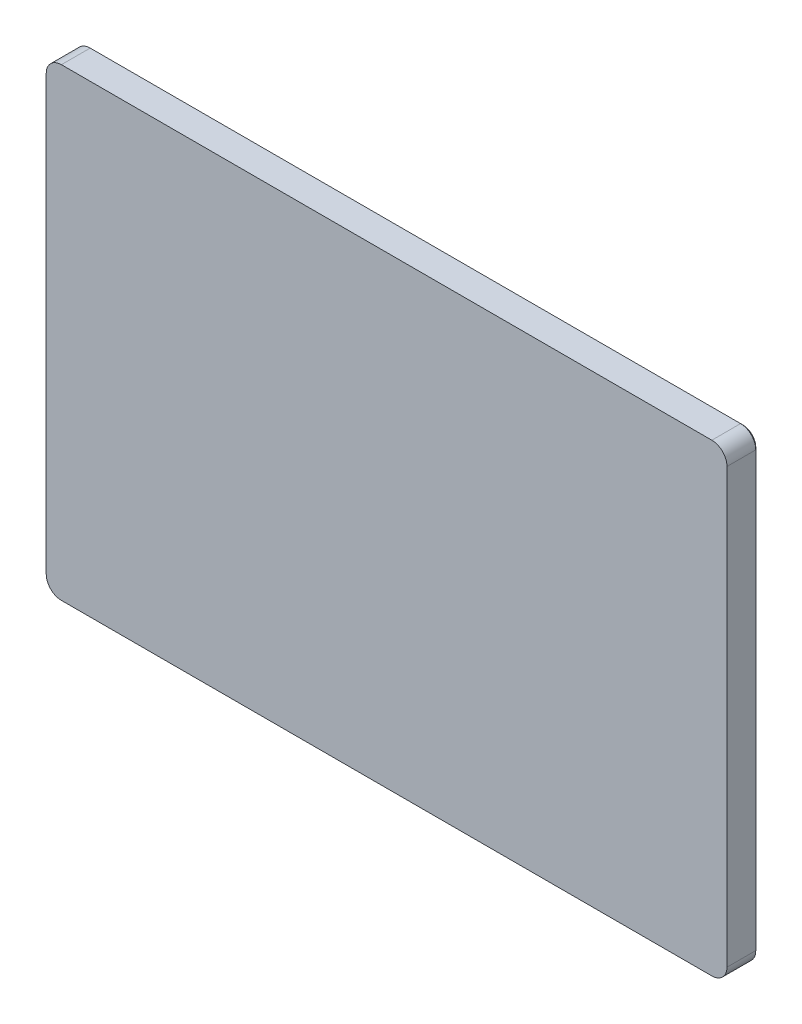
ISO-10303-21;
HEADER;
FILE_DESCRIPTION(('STEP AP214'),'2;1');
FILE_NAME('part.step','',(''),(''),'','','');
FILE_SCHEMA(('AUTOMOTIVE_DESIGN { 1 0 10303 214 1 1 1 1 }'));
ENDSEC;
DATA;
#1=APPLICATION_CONTEXT('core data for automotive mechanical design processes');
#2=APPLICATION_PROTOCOL_DEFINITION('international standard','automotive_design',2000,#1);
#3=PRODUCT_CONTEXT('',#1,'mechanical');
#4=PRODUCT('Part','Part','',(#3));
#5=PRODUCT_RELATED_PRODUCT_CATEGORY('part','',(#4));
#6=PRODUCT_DEFINITION_FORMATION('','',#4);
#7=PRODUCT_DEFINITION_CONTEXT('part definition',#1,'design');
#8=PRODUCT_DEFINITION('design','',#6,#7);
#9=PRODUCT_DEFINITION_SHAPE('','',#8);
#10=(LENGTH_UNIT() NAMED_UNIT(*) SI_UNIT(.MILLI.,.METRE.));
#11=(NAMED_UNIT(*) PLANE_ANGLE_UNIT() SI_UNIT($,.RADIAN.));
#12=(NAMED_UNIT(*) SI_UNIT($,.STERADIAN.) SOLID_ANGLE_UNIT());
#13=UNCERTAINTY_MEASURE_WITH_UNIT(LENGTH_MEASURE(1.E-05),#10,'distance_accuracy_value','');
#14=(GEOMETRIC_REPRESENTATION_CONTEXT(3) GLOBAL_UNCERTAINTY_ASSIGNED_CONTEXT((#13)) GLOBAL_UNIT_ASSIGNED_CONTEXT((#10,
#11,#12)) REPRESENTATION_CONTEXT('',''));
#15=CARTESIAN_POINT('',(0.,0.,0.));
#16=DIRECTION('',(0.,0.,1.));
#17=DIRECTION('',(1.,0.,0.));
#18=AXIS2_PLACEMENT_3D('',#15,#16,#17);
#19=CARTESIAN_POINT('',(-82.5000000000001,55.0000000000001,216.894210446127));
#20=DIRECTION('',(0.,0.,-1.));
#21=DIRECTION('',(-1.,0.,0.));
#22=AXIS2_PLACEMENT_3D('',#19,#20,#21);
#23=CYLINDRICAL_SURFACE('',#22,3.85);
#24=DIRECTION('',(0.,0.,-1.));
#25=VECTOR('',#24,1.);
#26=CARTESIAN_POINT('',(-82.5000000000001,58.8500000000001,216.894210446127));
#27=LINE('',#26,#25);
#28=CARTESIAN_POINT('',(-82.5000000000001,58.8500000000001,7.89999999999999));
#29=VERTEX_POINT('',#28);
#30=CARTESIAN_POINT('',(-82.5000000000001,58.8500000000001,0.599999999999962));
#31=VERTEX_POINT('',#30);
#32=EDGE_CURVE('E146',#29,#31,#27,.T.);
#33=ORIENTED_EDGE('',*,*,#32,.T.);
#34=CARTESIAN_POINT('',(-82.5000000000001,55.0000000000001,0.599999999999962));
#35=DIRECTION('',(0.,0.,1.));
#36=DIRECTION('',(1.,0.,0.));
#37=AXIS2_PLACEMENT_3D('',#34,#35,#36);
#38=CIRCLE('',#37,3.85);
#39=CARTESIAN_POINT('',(-86.3500000000001,55.0000000000001,0.599999999999962));
#40=VERTEX_POINT('',#39);
#41=EDGE_CURVE('E63',#31,#40,#38,.T.);
#42=ORIENTED_EDGE('',*,*,#41,.T.);
#43=DIRECTION('',(0.,0.,-1.));
#44=VECTOR('',#43,1.);
#45=CARTESIAN_POINT('',(-86.3500000000001,55.0000000000001,216.894210446127));
#46=LINE('',#45,#44);
#47=CARTESIAN_POINT('',(-86.3500000000001,55.0000000000001,7.89999999999999));
#48=VERTEX_POINT('',#47);
#49=EDGE_CURVE('E178',#48,#40,#46,.T.);
#50=ORIENTED_EDGE('',*,*,#49,.F.);
#51=CARTESIAN_POINT('',(-82.5000000000001,55.0000000000001,7.89999999999999));
#52=DIRECTION('',(0.,0.,1.));
#53=DIRECTION('',(1.,0.,0.));
#54=AXIS2_PLACEMENT_3D('',#51,#52,#53);
#55=CIRCLE('',#54,3.85);
#56=EDGE_CURVE('E151',#29,#48,#55,.T.);
#57=ORIENTED_EDGE('',*,*,#56,.F.);
#58=EDGE_LOOP('',(#33,#42,#50,#57));
#59=FACE_BOUND('',#58,.T.);
#60=ADVANCED_FACE('F41',(#59),#23,.T.);
#61=CARTESIAN_POINT('',(-86.3500000000001,-55.0000000000001,216.894210446127));
#62=DIRECTION('',(1.,0.,0.));
#63=DIRECTION('',(0.,0.,-1.));
#64=AXIS2_PLACEMENT_3D('',#61,#62,#63);
#65=PLANE('',#64);
#66=ORIENTED_EDGE('',*,*,#49,.T.);
#67=DIRECTION('',(0.,-1.,0.));
#68=VECTOR('',#67,1.);
#69=CARTESIAN_POINT('',(-86.3500000000001,-55.0000000000001,0.599999999999962));
#70=LINE('',#69,#68);
#71=CARTESIAN_POINT('',(-86.3500000000001,-55.0000000000001,0.599999999999962));
#72=VERTEX_POINT('',#71);
#73=EDGE_CURVE('E11',#40,#72,#70,.T.);
#74=ORIENTED_EDGE('',*,*,#73,.T.);
#75=DIRECTION('',(0.,0.,-1.));
#76=VECTOR('',#75,1.);
#77=CARTESIAN_POINT('',(-86.3500000000001,-55.0000000000001,216.894210446127));
#78=LINE('',#77,#76);
#79=CARTESIAN_POINT('',(-86.3500000000001,-55.0000000000001,7.89999999999999));
#80=VERTEX_POINT('',#79);
#81=EDGE_CURVE('E179',#80,#72,#78,.T.);
#82=ORIENTED_EDGE('',*,*,#81,.F.);
#83=DIRECTION('',(0.,-1.,0.));
#84=VECTOR('',#83,1.);
#85=CARTESIAN_POINT('',(-86.3500000000001,-55.0000000000001,7.89999999999999));
#86=LINE('',#85,#84);
#87=EDGE_CURVE('E172',#48,#80,#86,.T.);
#88=ORIENTED_EDGE('',*,*,#87,.F.);
#89=EDGE_LOOP('',(#66,#74,#82,#88));
#90=FACE_BOUND('',#89,.T.);
#91=ADVANCED_FACE('F286',(#90),#65,.F.);
#92=CARTESIAN_POINT('',(-82.5000000000001,-55.0000000000001,216.894210446127));
#93=DIRECTION('',(0.,0.,-1.));
#94=DIRECTION('',(-1.,0.,0.));
#95=AXIS2_PLACEMENT_3D('',#92,#93,#94);
#96=CYLINDRICAL_SURFACE('',#95,3.85000000000002);
#97=ORIENTED_EDGE('',*,*,#81,.T.);
#98=CARTESIAN_POINT('',(-82.5000000000001,-55.0000000000001,0.599999999999962));
#99=DIRECTION('',(0.,0.,1.));
#100=DIRECTION('',(1.,0.,0.));
#101=AXIS2_PLACEMENT_3D('',#98,#99,#100);
#102=CIRCLE('',#101,3.85000000000002);
#103=CARTESIAN_POINT('',(-82.5000000000001,-58.8500000000001,0.599999999999962));
#104=VERTEX_POINT('',#103);
#105=EDGE_CURVE('E51',#72,#104,#102,.T.);
#106=ORIENTED_EDGE('',*,*,#105,.T.);
#107=DIRECTION('',(0.,0.,-1.));
#108=VECTOR('',#107,1.);
#109=CARTESIAN_POINT('',(-82.5000000000001,-58.8500000000001,216.894210446127));
#110=LINE('',#109,#108);
#111=CARTESIAN_POINT('',(-82.5000000000001,-58.8500000000001,7.89999999999999));
#112=VERTEX_POINT('',#111);
#113=EDGE_CURVE('E185',#112,#104,#110,.T.);
#114=ORIENTED_EDGE('',*,*,#113,.F.);
#115=CARTESIAN_POINT('',(-82.5000000000001,-55.0000000000001,7.89999999999999));
#116=DIRECTION('',(0.,0.,1.));
#117=DIRECTION('',(1.,0.,0.));
#118=AXIS2_PLACEMENT_3D('',#115,#116,#117);
#119=CIRCLE('',#118,3.85000000000002);
#120=EDGE_CURVE('E171',#80,#112,#119,.T.);
#121=ORIENTED_EDGE('',*,*,#120,.F.);
#122=EDGE_LOOP('',(#97,#106,#114,#121));
#123=FACE_BOUND('',#122,.T.);
#124=ADVANCED_FACE('F295',(#123),#96,.T.);
#125=CARTESIAN_POINT('',(82.5000000000001,-58.8500000000001,216.894210446127));
#126=DIRECTION('',(0.,1.,0.));
#127=DIRECTION('',(-1.,0.,0.));
#128=AXIS2_PLACEMENT_3D('',#125,#126,#127);
#129=PLANE('',#128);
#130=ORIENTED_EDGE('',*,*,#113,.T.);
#131=DIRECTION('',(1.,0.,0.));
#132=VECTOR('',#131,1.);
#133=CARTESIAN_POINT('',(82.5000000000001,-58.8500000000001,0.599999999999962));
#134=LINE('',#133,#132);
#135=CARTESIAN_POINT('',(82.5000000000001,-58.8500000000001,0.599999999999962));
#136=VERTEX_POINT('',#135);
#137=EDGE_CURVE('E211',#104,#136,#134,.T.);
#138=ORIENTED_EDGE('',*,*,#137,.T.);
#139=DIRECTION('',(0.,0.,-1.));
#140=VECTOR('',#139,1.);
#141=CARTESIAN_POINT('',(82.5000000000001,-58.8500000000001,216.894210446127));
#142=LINE('',#141,#140);
#143=CARTESIAN_POINT('',(82.5000000000001,-58.8500000000001,7.89999999999999));
#144=VERTEX_POINT('',#143);
#145=EDGE_CURVE('E184',#144,#136,#142,.T.);
#146=ORIENTED_EDGE('',*,*,#145,.F.);
#147=DIRECTION('',(1.,0.,0.));
#148=VECTOR('',#147,1.);
#149=CARTESIAN_POINT('',(82.5000000000001,-58.8500000000001,7.89999999999999));
#150=LINE('',#149,#148);
#151=EDGE_CURVE('E166',#112,#144,#150,.T.);
#152=ORIENTED_EDGE('',*,*,#151,.F.);
#153=EDGE_LOOP('',(#130,#138,#146,#152));
#154=FACE_BOUND('',#153,.T.);
#155=ADVANCED_FACE('F413',(#154),#129,.F.);
#156=CARTESIAN_POINT('',(82.5000000000001,-55.0000000000001,216.894210446127));
#157=DIRECTION('',(0.,0.,-1.));
#158=DIRECTION('',(-1.,0.,0.));
#159=AXIS2_PLACEMENT_3D('',#156,#157,#158);
#160=CYLINDRICAL_SURFACE('',#159,3.85);
#161=ORIENTED_EDGE('',*,*,#145,.T.);
#162=CARTESIAN_POINT('',(82.5000000000001,-55.0000000000001,0.599999999999962));
#163=DIRECTION('',(0.,0.,1.));
#164=DIRECTION('',(1.,0.,0.));
#165=AXIS2_PLACEMENT_3D('',#162,#163,#164);
#166=CIRCLE('',#165,3.85);
#167=CARTESIAN_POINT('',(86.3500000000001,-55.0000000000001,0.599999999999962));
#168=VERTEX_POINT('',#167);
#169=EDGE_CURVE('E208',#136,#168,#166,.T.);
#170=ORIENTED_EDGE('',*,*,#169,.T.);
#171=DIRECTION('',(0.,0.,-1.));
#172=VECTOR('',#171,1.);
#173=CARTESIAN_POINT('',(86.3500000000001,-55.0000000000001,216.894210446127));
#174=LINE('',#173,#172);
#175=CARTESIAN_POINT('',(86.3500000000001,-55.0000000000001,7.89999999999999));
#176=VERTEX_POINT('',#175);
#177=EDGE_CURVE('E189',#176,#168,#174,.T.);
#178=ORIENTED_EDGE('',*,*,#177,.F.);
#179=CARTESIAN_POINT('',(82.5000000000001,-55.0000000000001,7.89999999999999));
#180=DIRECTION('',(0.,0.,1.));
#181=DIRECTION('',(1.,0.,0.));
#182=AXIS2_PLACEMENT_3D('',#179,#180,#181);
#183=CIRCLE('',#182,3.85);
#184=EDGE_CURVE('E165',#144,#176,#183,.T.);
#185=ORIENTED_EDGE('',*,*,#184,.F.);
#186=EDGE_LOOP('',(#161,#170,#178,#185));
#187=FACE_BOUND('',#186,.T.);
#188=ADVANCED_FACE('F261',(#187),#160,.T.);
#189=CARTESIAN_POINT('',(86.3500000000001,55.0000000000001,216.894210446127));
#190=DIRECTION('',(-1.,0.,0.));
#191=DIRECTION('',(0.,0.,1.));
#192=AXIS2_PLACEMENT_3D('',#189,#190,#191);
#193=PLANE('',#192);
#194=ORIENTED_EDGE('',*,*,#177,.T.);
#195=DIRECTION('',(0.,1.,0.));
#196=VECTOR('',#195,1.);
#197=CARTESIAN_POINT('',(86.3500000000001,55.0000000000001,0.599999999999962));
#198=LINE('',#197,#196);
#199=CARTESIAN_POINT('',(86.3500000000001,55.0000000000001,0.599999999999962));
#200=VERTEX_POINT('',#199);
#201=EDGE_CURVE('E157',#168,#200,#198,.T.);
#202=ORIENTED_EDGE('',*,*,#201,.T.);
#203=DIRECTION('',(0.,0.,-1.));
#204=VECTOR('',#203,1.);
#205=CARTESIAN_POINT('',(86.3500000000001,55.0000000000001,216.894210446127));
#206=LINE('',#205,#204);
#207=CARTESIAN_POINT('',(86.3500000000001,55.0000000000001,7.89999999999999));
#208=VERTEX_POINT('',#207);
#209=EDGE_CURVE('E143',#208,#200,#206,.T.);
#210=ORIENTED_EDGE('',*,*,#209,.F.);
#211=DIRECTION('',(0.,1.,0.));
#212=VECTOR('',#211,1.);
#213=CARTESIAN_POINT('',(86.3500000000001,55.0000000000001,7.89999999999999));
#214=LINE('',#213,#212);
#215=EDGE_CURVE('E156',#176,#208,#214,.T.);
#216=ORIENTED_EDGE('',*,*,#215,.F.);
#217=EDGE_LOOP('',(#194,#202,#210,#216));
#218=FACE_BOUND('',#217,.T.);
#219=ADVANCED_FACE('F268',(#218),#193,.F.);
#220=CARTESIAN_POINT('',(82.5000000000001,55.0000000000001,216.894210446127));
#221=DIRECTION('',(0.,0.,-1.));
#222=DIRECTION('',(-1.,0.,0.));
#223=AXIS2_PLACEMENT_3D('',#220,#221,#222);
#224=CYLINDRICAL_SURFACE('',#223,3.85);
#225=ORIENTED_EDGE('',*,*,#209,.T.);
#226=CARTESIAN_POINT('',(82.5000000000001,55.0000000000001,0.599999999999962));
#227=DIRECTION('',(0.,0.,1.));
#228=DIRECTION('',(1.,0.,0.));
#229=AXIS2_PLACEMENT_3D('',#226,#227,#228);
#230=CIRCLE('',#229,3.85);
#231=CARTESIAN_POINT('',(82.5000000000001,58.8500000000001,0.599999999999962));
#232=VERTEX_POINT('',#231);
#233=EDGE_CURVE('E142',#200,#232,#230,.T.);
#234=ORIENTED_EDGE('',*,*,#233,.T.);
#235=DIRECTION('',(0.,0.,-1.));
#236=VECTOR('',#235,1.);
#237=CARTESIAN_POINT('',(82.5000000000001,58.8500000000001,216.894210446127));
#238=LINE('',#237,#236);
#239=CARTESIAN_POINT('',(82.5000000000001,58.8500000000001,7.89999999999999));
#240=VERTEX_POINT('',#239);
#241=EDGE_CURVE('E131',#240,#232,#238,.T.);
#242=ORIENTED_EDGE('',*,*,#241,.F.);
#243=CARTESIAN_POINT('',(82.5000000000001,55.0000000000001,7.89999999999999));
#244=DIRECTION('',(0.,0.,1.));
#245=DIRECTION('',(1.,0.,0.));
#246=AXIS2_PLACEMENT_3D('',#243,#244,#245);
#247=CIRCLE('',#246,3.85);
#248=EDGE_CURVE('E136',#208,#240,#247,.T.);
#249=ORIENTED_EDGE('',*,*,#248,.F.);
#250=EDGE_LOOP('',(#225,#234,#242,#249));
#251=FACE_BOUND('',#250,.T.);
#252=ADVANCED_FACE('F138',(#251),#224,.T.);
#253=CARTESIAN_POINT('',(-82.5000000000001,58.8500000000001,216.894210446127));
#254=DIRECTION('',(0.,-1.,0.));
#255=DIRECTION('',(1.,0.,0.));
#256=AXIS2_PLACEMENT_3D('',#253,#254,#255);
#257=PLANE('',#256);
#258=ORIENTED_EDGE('',*,*,#241,.T.);
#259=DIRECTION('',(-1.,0.,0.));
#260=VECTOR('',#259,1.);
#261=CARTESIAN_POINT('',(-82.5000000000001,58.8500000000001,0.599999999999962));
#262=LINE('',#261,#260);
#263=EDGE_CURVE('E215',#232,#31,#262,.T.);
#264=ORIENTED_EDGE('',*,*,#263,.T.);
#265=ORIENTED_EDGE('',*,*,#32,.F.);
#266=DIRECTION('',(-1.,0.,0.));
#267=VECTOR('',#266,1.);
#268=CARTESIAN_POINT('',(-82.5000000000001,58.8500000000001,7.89999999999999));
#269=LINE('',#268,#267);
#270=EDGE_CURVE('E144',#240,#29,#269,.T.);
#271=ORIENTED_EDGE('',*,*,#270,.F.);
#272=EDGE_LOOP('',(#258,#264,#265,#271));
#273=FACE_BOUND('',#272,.T.);
#274=ADVANCED_FACE('F149',(#273),#257,.F.);
#275=CARTESIAN_POINT('',(-82.5000000000001,55.0000000000001,0.));
#276=DIRECTION('',(0.,0.,1.));
#277=DIRECTION('',(1.,0.,0.));
#278=AXIS2_PLACEMENT_3D('',#275,#276,#277);
#279=PLANE('',#278);
#280=CARTESIAN_POINT('',(82.5000000000001,55.0000000000001,0.));
#281=DIRECTION('',(0.,0.,1.));
#282=DIRECTION('',(1.,0.,0.));
#283=AXIS2_PLACEMENT_3D('',#280,#281,#282);
#284=CIRCLE('',#283,3.25000000000004);
#285=CARTESIAN_POINT('',(82.5000000000001,58.2500000000001,0.));
#286=VERTEX_POINT('',#285);
#287=CARTESIAN_POINT('',(85.7500000000001,55.0000000000001,0.));
#288=VERTEX_POINT('',#287);
#289=EDGE_CURVE('E202',#286,#288,#284,.F.);
#290=ORIENTED_EDGE('',*,*,#289,.T.);
#291=DIRECTION('',(0.,-1.,0.));
#292=VECTOR('',#291,1.);
#293=CARTESIAN_POINT('',(85.7500000000001,55.0000000000001,0.));
#294=LINE('',#293,#292);
#295=CARTESIAN_POINT('',(85.7500000000001,-55.0000000000001,0.));
#296=VERTEX_POINT('',#295);
#297=EDGE_CURVE('E207',#288,#296,#294,.T.);
#298=ORIENTED_EDGE('',*,*,#297,.T.);
#299=CARTESIAN_POINT('',(82.5000000000001,-55.0000000000001,0.));
#300=DIRECTION('',(0.,0.,1.));
#301=DIRECTION('',(1.,0.,0.));
#302=AXIS2_PLACEMENT_3D('',#299,#300,#301);
#303=CIRCLE('',#302,3.25000000000004);
#304=CARTESIAN_POINT('',(82.5000000000001,-58.2500000000001,0.));
#305=VERTEX_POINT('',#304);
#306=EDGE_CURVE('E205',#296,#305,#303,.F.);
#307=ORIENTED_EDGE('',*,*,#306,.T.);
#308=DIRECTION('',(-1.,0.,0.));
#309=VECTOR('',#308,1.);
#310=CARTESIAN_POINT('',(-82.5000000000001,-58.2500000000002,0.));
#311=LINE('',#310,#309);
#312=CARTESIAN_POINT('',(-82.5000000000001,-58.2500000000001,0.));
#313=VERTEX_POINT('',#312);
#314=EDGE_CURVE('E196',#305,#313,#311,.T.);
#315=ORIENTED_EDGE('',*,*,#314,.T.);
#316=CARTESIAN_POINT('',(-82.5000000000001,-55.0000000000001,0.));
#317=DIRECTION('',(0.,0.,1.));
#318=DIRECTION('',(1.,0.,0.));
#319=AXIS2_PLACEMENT_3D('',#316,#317,#318);
#320=CIRCLE('',#319,3.25000000000006);
#321=CARTESIAN_POINT('',(-85.7500000000001,-55.0000000000001,0.));
#322=VERTEX_POINT('',#321);
#323=EDGE_CURVE('E191',#313,#322,#320,.F.);
#324=ORIENTED_EDGE('',*,*,#323,.T.);
#325=DIRECTION('',(0.,1.,0.));
#326=VECTOR('',#325,1.);
#327=CARTESIAN_POINT('',(-85.7500000000001,55.0000000000001,0.));
#328=LINE('',#327,#326);
#329=CARTESIAN_POINT('',(-85.7500000000001,55.0000000000001,0.));
#330=VERTEX_POINT('',#329);
#331=EDGE_CURVE('E162',#322,#330,#328,.T.);
#332=ORIENTED_EDGE('',*,*,#331,.T.);
#333=CARTESIAN_POINT('',(-82.5000000000001,55.0000000000001,0.));
#334=DIRECTION('',(0.,0.,1.));
#335=DIRECTION('',(1.,0.,0.));
#336=AXIS2_PLACEMENT_3D('',#333,#334,#335);
#337=CIRCLE('',#336,3.25000000000004);
#338=CARTESIAN_POINT('',(-82.5000000000001,58.2500000000001,0.));
#339=VERTEX_POINT('',#338);
#340=EDGE_CURVE('E198',#330,#339,#337,.F.);
#341=ORIENTED_EDGE('',*,*,#340,.T.);
#342=DIRECTION('',(1.,0.,0.));
#343=VECTOR('',#342,1.);
#344=CARTESIAN_POINT('',(-82.5000000000001,58.2500000000001,0.));
#345=LINE('',#344,#343);
#346=EDGE_CURVE('E197',#339,#286,#345,.T.);
#347=ORIENTED_EDGE('',*,*,#346,.T.);
#348=EDGE_LOOP('',(#290,#298,#307,#315,#324,#332,#341,#347));
#349=FACE_BOUND('',#348,.T.);
#350=ADVANCED_FACE('F247',(#349),#279,.F.);
#351=CARTESIAN_POINT('',(-82.5000000000001,-55.0000000000001,7.9));
#352=DIRECTION('',(0.,0.,1.));
#353=DIRECTION('',(1.,0.,0.));
#354=AXIS2_PLACEMENT_3D('',#351,#352,#353);
#355=PLANE('',#354);
#356=ORIENTED_EDGE('',*,*,#270,.T.);
#357=ORIENTED_EDGE('',*,*,#56,.T.);
#358=ORIENTED_EDGE('',*,*,#87,.T.);
#359=ORIENTED_EDGE('',*,*,#120,.T.);
#360=ORIENTED_EDGE('',*,*,#151,.T.);
#361=ORIENTED_EDGE('',*,*,#184,.T.);
#362=ORIENTED_EDGE('',*,*,#215,.T.);
#363=ORIENTED_EDGE('',*,*,#248,.T.);
#364=EDGE_LOOP('',(#356,#357,#358,#359,#360,#361,#362,#363));
#365=FACE_BOUND('',#364,.T.);
#366=ADVANCED_FACE('F158',(#365),#355,.T.);
#367=CARTESIAN_POINT('',(-86.3500000000001,-55.0000000000001,0.599999999999962));
#368=DIRECTION('',(0.707106781186548,0.,0.707106781186548));
#369=DIRECTION('',(0.,-1.,0.));
#370=AXIS2_PLACEMENT_3D('',#367,#368,#369);
#371=PLANE('',#370);
#372=DIRECTION('',(-0.707106781186548,0.,0.707106781186548));
#373=VECTOR('',#372,1.);
#374=CARTESIAN_POINT('',(-85.7500000000001,55.0000000000001,0.));
#375=LINE('',#374,#373);
#376=EDGE_CURVE('E231',#330,#40,#375,.T.);
#377=ORIENTED_EDGE('',*,*,#376,.F.);
#378=ORIENTED_EDGE('',*,*,#331,.F.);
#379=DIRECTION('',(0.707106781186548,0.,-0.707106781186548));
#380=VECTOR('',#379,1.);
#381=CARTESIAN_POINT('',(-86.3500000000001,-55.0000000000001,0.599999999999962));
#382=LINE('',#381,#380);
#383=EDGE_CURVE('E46',#72,#322,#382,.T.);
#384=ORIENTED_EDGE('',*,*,#383,.F.);
#385=ORIENTED_EDGE('',*,*,#73,.F.);
#386=EDGE_LOOP('',(#377,#378,#384,#385));
#387=FACE_BOUND('',#386,.T.);
#388=ADVANCED_FACE('F42',(#387),#371,.F.);
#389=CARTESIAN_POINT('',(-82.5000000000001,-55.0000000000001,0.599999999999962));
#390=DIRECTION('',(0.,0.,1.));
#391=DIRECTION('',(1.,0.,0.));
#392=AXIS2_PLACEMENT_3D('',#389,#390,#391);
#393=CONICAL_SURFACE('',#392,3.85000000000002,0.785398163397451);
#394=ORIENTED_EDGE('',*,*,#383,.T.);
#395=ORIENTED_EDGE('',*,*,#323,.F.);
#396=DIRECTION('',(0.,0.707106781186552,-0.707106781186543));
#397=VECTOR('',#396,1.);
#398=CARTESIAN_POINT('',(-82.5000000000001,-58.8500000000001,0.599999999999962));
#399=LINE('',#398,#397);
#400=EDGE_CURVE('E233',#104,#313,#399,.T.);
#401=ORIENTED_EDGE('',*,*,#400,.F.);
#402=ORIENTED_EDGE('',*,*,#105,.F.);
#403=EDGE_LOOP('',(#394,#395,#401,#402));
#404=FACE_BOUND('',#403,.T.);
#405=ADVANCED_FACE('F243',(#404),#393,.T.);
#406=CARTESIAN_POINT('',(-82.5000000000001,55.0000000000001,0.599999999999962));
#407=DIRECTION('',(0.,0.,1.));
#408=DIRECTION('',(1.,0.,0.));
#409=AXIS2_PLACEMENT_3D('',#406,#407,#408);
#410=CONICAL_SURFACE('',#409,3.85,0.785398163397448);
#411=ORIENTED_EDGE('',*,*,#376,.T.);
#412=ORIENTED_EDGE('',*,*,#41,.F.);
#413=DIRECTION('',(0.,0.707106781186548,0.707106781186548));
#414=VECTOR('',#413,1.);
#415=CARTESIAN_POINT('',(-82.5000000000001,58.2500000000001,0.));
#416=LINE('',#415,#414);
#417=EDGE_CURVE('E226',#339,#31,#416,.T.);
#418=ORIENTED_EDGE('',*,*,#417,.F.);
#419=ORIENTED_EDGE('',*,*,#340,.F.);
#420=EDGE_LOOP('',(#411,#412,#418,#419));
#421=FACE_BOUND('',#420,.T.);
#422=ADVANCED_FACE('F279',(#421),#410,.T.);
#423=CARTESIAN_POINT('',(82.5000000000001,-58.8500000000001,0.599999999999962));
#424=DIRECTION('',(0.,0.707106781186548,0.707106781186548));
#425=DIRECTION('',(1.,0.,0.));
#426=AXIS2_PLACEMENT_3D('',#423,#424,#425);
#427=PLANE('',#426);
#428=ORIENTED_EDGE('',*,*,#400,.T.);
#429=ORIENTED_EDGE('',*,*,#314,.F.);
#430=DIRECTION('',(0.,0.707106781186548,-0.707106781186548));
#431=VECTOR('',#430,1.);
#432=CARTESIAN_POINT('',(82.5000000000001,-58.8500000000001,0.599999999999962));
#433=LINE('',#432,#431);
#434=EDGE_CURVE('E224',#136,#305,#433,.T.);
#435=ORIENTED_EDGE('',*,*,#434,.F.);
#436=ORIENTED_EDGE('',*,*,#137,.F.);
#437=EDGE_LOOP('',(#428,#429,#435,#436));
#438=FACE_BOUND('',#437,.T.);
#439=ADVANCED_FACE('F251',(#438),#427,.F.);
#440=CARTESIAN_POINT('',(-82.5000000000001,58.8500000000001,0.599999999999962));
#441=DIRECTION('',(0.,-0.707106781186548,0.707106781186548));
#442=DIRECTION('',(-1.,0.,0.));
#443=AXIS2_PLACEMENT_3D('',#440,#441,#442);
#444=PLANE('',#443);
#445=ORIENTED_EDGE('',*,*,#417,.T.);
#446=ORIENTED_EDGE('',*,*,#263,.F.);
#447=DIRECTION('',(0.,0.707106781186548,0.707106781186548));
#448=VECTOR('',#447,1.);
#449=CARTESIAN_POINT('',(82.5000000000001,58.2500000000001,0.));
#450=LINE('',#449,#448);
#451=EDGE_CURVE('E225',#286,#232,#450,.T.);
#452=ORIENTED_EDGE('',*,*,#451,.F.);
#453=ORIENTED_EDGE('',*,*,#346,.F.);
#454=EDGE_LOOP('',(#445,#446,#452,#453));
#455=FACE_BOUND('',#454,.T.);
#456=ADVANCED_FACE('F280',(#455),#444,.F.);
#457=CARTESIAN_POINT('',(82.5000000000001,-55.0000000000001,0.599999999999962));
#458=DIRECTION('',(0.,0.,1.));
#459=DIRECTION('',(1.,0.,0.));
#460=AXIS2_PLACEMENT_3D('',#457,#458,#459);
#461=CONICAL_SURFACE('',#460,3.85,0.785398163397448);
#462=ORIENTED_EDGE('',*,*,#434,.T.);
#463=ORIENTED_EDGE('',*,*,#306,.F.);
#464=DIRECTION('',(-0.707106781186548,0.,-0.707106781186548));
#465=VECTOR('',#464,1.);
#466=CARTESIAN_POINT('',(86.3500000000001,-55.0000000000001,0.599999999999962));
#467=LINE('',#466,#465);
#468=EDGE_CURVE('E217',#168,#296,#467,.T.);
#469=ORIENTED_EDGE('',*,*,#468,.F.);
#470=ORIENTED_EDGE('',*,*,#169,.F.);
#471=EDGE_LOOP('',(#462,#463,#469,#470));
#472=FACE_BOUND('',#471,.T.);
#473=ADVANCED_FACE('F259',(#472),#461,.T.);
#474=CARTESIAN_POINT('',(82.5000000000001,55.0000000000001,0.599999999999962));
#475=DIRECTION('',(0.,0.,1.));
#476=DIRECTION('',(1.,0.,0.));
#477=AXIS2_PLACEMENT_3D('',#474,#475,#476);
#478=CONICAL_SURFACE('',#477,3.85,0.785398163397445);
#479=ORIENTED_EDGE('',*,*,#451,.T.);
#480=ORIENTED_EDGE('',*,*,#233,.F.);
#481=DIRECTION('',(0.707106781186548,0.,0.707106781186548));
#482=VECTOR('',#481,1.);
#483=CARTESIAN_POINT('',(85.7500000000001,55.0000000000001,0.));
#484=LINE('',#483,#482);
#485=EDGE_CURVE('E216',#288,#200,#484,.T.);
#486=ORIENTED_EDGE('',*,*,#485,.F.);
#487=ORIENTED_EDGE('',*,*,#289,.F.);
#488=EDGE_LOOP('',(#479,#480,#486,#487));
#489=FACE_BOUND('',#488,.T.);
#490=ADVANCED_FACE('F271',(#489),#478,.T.);
#491=CARTESIAN_POINT('',(86.3500000000001,55.0000000000001,0.599999999999962));
#492=DIRECTION('',(-0.707106781186548,0.,0.707106781186548));
#493=DIRECTION('',(0.,1.,0.));
#494=AXIS2_PLACEMENT_3D('',#491,#492,#493);
#495=PLANE('',#494);
#496=ORIENTED_EDGE('',*,*,#468,.T.);
#497=ORIENTED_EDGE('',*,*,#297,.F.);
#498=ORIENTED_EDGE('',*,*,#485,.T.);
#499=ORIENTED_EDGE('',*,*,#201,.F.);
#500=EDGE_LOOP('',(#496,#497,#498,#499));
#501=FACE_BOUND('',#500,.T.);
#502=ADVANCED_FACE('F266',(#501),#495,.F.);
#503=CLOSED_SHELL('',(#60,#91,#124,#155,#188,#219,#252,#274,#350,#366,#388,#405,#422,#439,#456,
#473,#490,#502));
#504=MANIFOLD_SOLID_BREP('B2',#503);
#505=ADVANCED_BREP_SHAPE_REPRESENTATION('',(#18,#504),#14);
#506=SHAPE_DEFINITION_REPRESENTATION(#9,#505);
ENDSEC;
END-ISO-10303-21;
